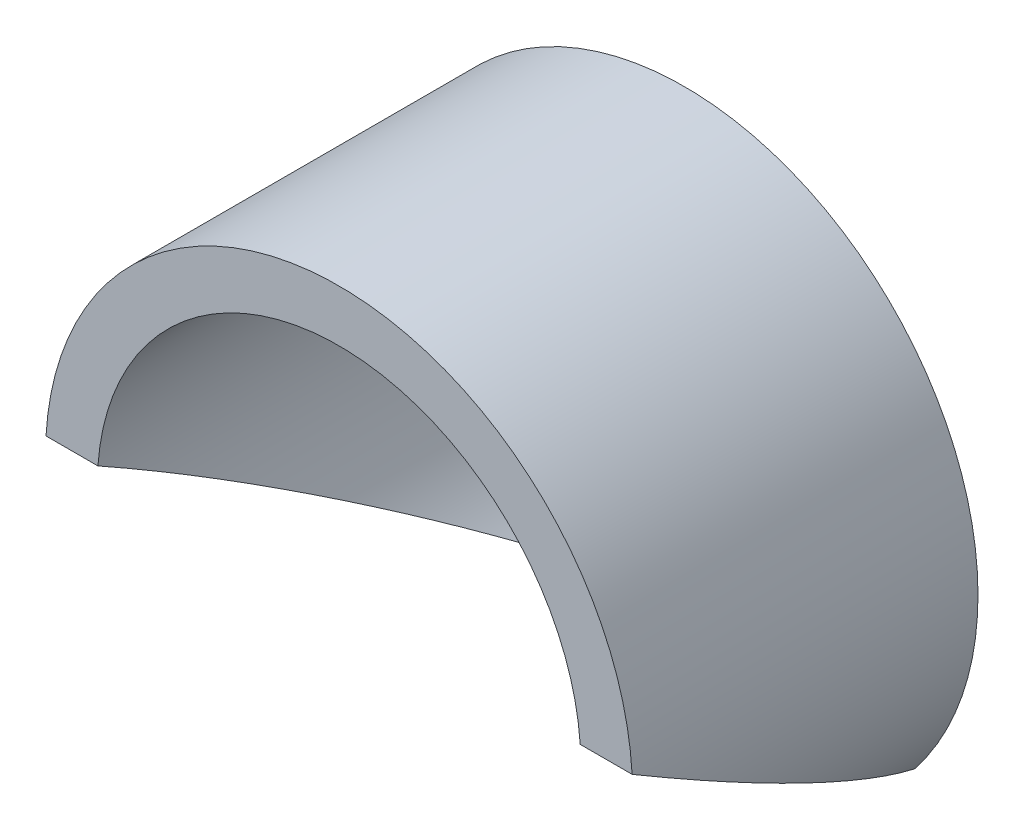
ISO-10303-21;
HEADER;
FILE_DESCRIPTION(('STEP AP214'),'2;1');
FILE_NAME('part.step','',(''),(''),'','','');
FILE_SCHEMA(('AUTOMOTIVE_DESIGN { 1 0 10303 214 1 1 1 1 }'));
ENDSEC;
DATA;
#1=APPLICATION_CONTEXT('core data for automotive mechanical design processes');
#2=APPLICATION_PROTOCOL_DEFINITION('international standard','automotive_design',2000,#1);
#3=PRODUCT_CONTEXT('',#1,'mechanical');
#4=PRODUCT('Part','Part','',(#3));
#5=PRODUCT_RELATED_PRODUCT_CATEGORY('part','',(#4));
#6=PRODUCT_DEFINITION_FORMATION('','',#4);
#7=PRODUCT_DEFINITION_CONTEXT('part definition',#1,'design');
#8=PRODUCT_DEFINITION('design','',#6,#7);
#9=PRODUCT_DEFINITION_SHAPE('','',#8);
#10=(LENGTH_UNIT() NAMED_UNIT(*) SI_UNIT(.MILLI.,.METRE.));
#11=(NAMED_UNIT(*) PLANE_ANGLE_UNIT() SI_UNIT($,.RADIAN.));
#12=(NAMED_UNIT(*) SI_UNIT($,.STERADIAN.) SOLID_ANGLE_UNIT());
#13=UNCERTAINTY_MEASURE_WITH_UNIT(LENGTH_MEASURE(1.E-05),#10,'distance_accuracy_value','');
#14=(GEOMETRIC_REPRESENTATION_CONTEXT(3) GLOBAL_UNCERTAINTY_ASSIGNED_CONTEXT((#13)) GLOBAL_UNIT_ASSIGNED_CONTEXT((#10,
#11,#12)) REPRESENTATION_CONTEXT('',''));
#15=CARTESIAN_POINT('',(0.,0.,0.));
#16=DIRECTION('',(0.,0.,1.));
#17=DIRECTION('',(1.,0.,0.));
#18=AXIS2_PLACEMENT_3D('',#15,#16,#17);
#19=CARTESIAN_POINT('',(0.,0.,57.2500000000001));
#20=DIRECTION('',(0.,0.,1.));
#21=DIRECTION('',(1.,0.,0.));
#22=AXIS2_PLACEMENT_3D('',#19,#20,#21);
#23=PLANE('',#22);
#24=DIRECTION('',(-1.,0.,0.));
#25=VECTOR('',#24,1.);
#26=CARTESIAN_POINT('',(122.20013168598,106.324972242779,57.2500000000001));
#27=LINE('',#26,#25);
#28=CARTESIAN_POINT('',(126.312859700873,106.324972242779,57.2500000000001));
#29=VERTEX_POINT('',#28);
#30=CARTESIAN_POINT('',(122.20013168598,106.324972242779,57.2500000000001));
#31=VERTEX_POINT('',#30);
#32=EDGE_CURVE('E167',#29,#31,#27,.T.);
#33=ORIENTED_EDGE('',*,*,#32,.T.);
#34=CARTESIAN_POINT('',(112.95013168598,116.833897021271,57.2500000000001));
#35=DIRECTION('',(0.,0.,1.));
#36=DIRECTION('',(1.,0.,0.));
#37=AXIS2_PLACEMENT_3D('',#34,#35,#36);
#38=CIRCLE('',#37,14.);
#39=CARTESIAN_POINT('',(103.70013168598,106.324972242779,57.2500000000001));
#40=VERTEX_POINT('',#39);
#41=EDGE_CURVE('E146',#31,#40,#38,.T.);
#42=ORIENTED_EDGE('',*,*,#41,.T.);
#43=DIRECTION('',(-1.,0.,0.));
#44=VECTOR('',#43,1.);
#45=CARTESIAN_POINT('',(0.,106.324972242779,57.2500000000001));
#46=LINE('',#45,#44);
#47=CARTESIAN_POINT('',(99.5874036710872,106.324972242779,57.2500000000001));
#48=VERTEX_POINT('',#47);
#49=EDGE_CURVE('E156',#40,#48,#46,.T.);
#50=ORIENTED_EDGE('',*,*,#49,.T.);
#51=CARTESIAN_POINT('',(112.95013168598,116.833897021271,57.2500000000001));
#52=DIRECTION('',(0.,0.,-1.));
#53=DIRECTION('',(1.,0.,0.));
#54=AXIS2_PLACEMENT_3D('',#51,#52,#53);
#55=CIRCLE('',#54,17.);
#56=EDGE_CURVE('E169',#48,#29,#55,.T.);
#57=ORIENTED_EDGE('',*,*,#56,.T.);
#58=EDGE_LOOP('',(#33,#42,#50,#57));
#59=FACE_BOUND('',#58,.T.);
#60=ADVANCED_FACE('F84',(#59),#23,.F.);
#61=CARTESIAN_POINT('',(122.20013168598,106.324972242779,77.2500000000001));
#62=DIRECTION('',(0.,-1.,0.));
#63=DIRECTION('',(0.,0.,-1.));
#64=AXIS2_PLACEMENT_3D('',#61,#62,#63);
#65=PLANE('',#64);
#66=DIRECTION('',(0.,0.,-1.));
#67=VECTOR('',#66,1.);
#68=CARTESIAN_POINT('',(126.312859700873,106.324972242779,77.2500000000001));
#69=LINE('',#68,#67);
#70=CARTESIAN_POINT('',(126.312859700873,106.324972242779,57.3314157129576));
#71=VERTEX_POINT('',#70);
#72=EDGE_CURVE('E152',#71,#29,#69,.T.);
#73=ORIENTED_EDGE('',*,*,#72,.F.);
#74=DIRECTION('',(-1.,0.,0.));
#75=VECTOR('',#74,1.);
#76=CARTESIAN_POINT('',(122.20013168598,106.324972242779,57.3314157129576));
#77=LINE('',#76,#75);
#78=CARTESIAN_POINT('',(122.20013168598,106.324972242779,57.3314157129576));
#79=VERTEX_POINT('',#78);
#80=EDGE_CURVE('E186',#71,#79,#77,.T.);
#81=ORIENTED_EDGE('',*,*,#80,.T.);
#82=DIRECTION('',(0.,0.,-1.));
#83=VECTOR('',#82,1.);
#84=CARTESIAN_POINT('',(122.20013168598,106.324972242779,77.2500000000001));
#85=LINE('',#84,#83);
#86=EDGE_CURVE('E179',#79,#31,#85,.T.);
#87=ORIENTED_EDGE('',*,*,#86,.T.);
#88=ORIENTED_EDGE('',*,*,#32,.F.);
#89=EDGE_LOOP('',(#73,#81,#87,#88));
#90=FACE_BOUND('',#89,.T.);
#91=ADVANCED_FACE('F209',(#90),#65,.T.);
#92=CARTESIAN_POINT('',(112.95013168598,116.833897021271,77.2500000000001));
#93=DIRECTION('',(0.,0.,-1.));
#94=DIRECTION('',(-1.,0.,0.));
#95=AXIS2_PLACEMENT_3D('',#92,#93,#94);
#96=CYLINDRICAL_SURFACE('',#95,14.);
#97=ORIENTED_EDGE('',*,*,#86,.F.);
#98=CARTESIAN_POINT('',(112.95013168598,116.833897021271,75.5334073622251));
#99=DIRECTION('',(0.,0.866025403784441,-0.499999999999996));
#100=DIRECTION('',(0.,-0.499999999999996,-0.866025403784441));
#101=AXIS2_PLACEMENT_3D('',#98,#99,#100);
#102=ELLIPSE('',#101,28.0000000000002,14.);
#103=CARTESIAN_POINT('',(126.915007979929,117.824972242779,77.2500000000001));
#104=VERTEX_POINT('',#103);
#105=EDGE_CURVE('E192',#79,#104,#102,.F.);
#106=ORIENTED_EDGE('',*,*,#105,.T.);
#107=CARTESIAN_POINT('',(112.95013168598,116.833897021271,77.2500000000001));
#108=DIRECTION('',(0.,0.,1.));
#109=DIRECTION('',(1.,0.,0.));
#110=AXIS2_PLACEMENT_3D('',#107,#108,#109);
#111=CIRCLE('',#110,14.);
#112=CARTESIAN_POINT('',(98.9852553920305,117.824972242779,77.2500000000001));
#113=VERTEX_POINT('',#112);
#114=EDGE_CURVE('E178',#104,#113,#111,.T.);
#115=ORIENTED_EDGE('',*,*,#114,.T.);
#116=CARTESIAN_POINT('',(112.95013168598,116.833897021271,75.5334073622251));
#117=DIRECTION('',(0.,-0.866025403784441,0.499999999999996));
#118=DIRECTION('',(0.,-0.499999999999996,-0.866025403784441));
#119=AXIS2_PLACEMENT_3D('',#116,#117,#118);
#120=ELLIPSE('',#119,28.0000000000002,14.);
#121=CARTESIAN_POINT('',(103.70013168598,106.324972242779,57.3314157129576));
#122=VERTEX_POINT('',#121);
#123=EDGE_CURVE('E149',#113,#122,#120,.T.);
#124=ORIENTED_EDGE('',*,*,#123,.T.);
#125=DIRECTION('',(0.,0.,-1.));
#126=VECTOR('',#125,1.);
#127=CARTESIAN_POINT('',(103.70013168598,106.324972242779,77.2500000000001));
#128=LINE('',#127,#126);
#129=EDGE_CURVE('E141',#122,#40,#128,.T.);
#130=ORIENTED_EDGE('',*,*,#129,.T.);
#131=ORIENTED_EDGE('',*,*,#41,.F.);
#132=EDGE_LOOP('',(#97,#106,#115,#124,#130,#131));
#133=FACE_BOUND('',#132,.T.);
#134=ADVANCED_FACE('F144',(#133),#96,.F.);
#135=CARTESIAN_POINT('',(112.95013168598,116.833897021271,77.2500000000001));
#136=DIRECTION('',(0.,0.,-1.));
#137=DIRECTION('',(-1.,0.,0.));
#138=AXIS2_PLACEMENT_3D('',#135,#136,#137);
#139=CYLINDRICAL_SURFACE('',#138,17.);
#140=CARTESIAN_POINT('',(112.95013168598,116.833897021271,77.2500000000001));
#141=DIRECTION('',(0.,0.,-1.));
#142=DIRECTION('',(1.,0.,0.));
#143=AXIS2_PLACEMENT_3D('',#140,#141,#142);
#144=CIRCLE('',#143,17.);
#145=CARTESIAN_POINT('',(95.9790453947224,117.824972242779,77.2500000000001));
#146=VERTEX_POINT('',#145);
#147=CARTESIAN_POINT('',(129.921217977238,117.824972242779,77.2500000000001));
#148=VERTEX_POINT('',#147);
#149=EDGE_CURVE('E153',#146,#148,#144,.T.);
#150=ORIENTED_EDGE('',*,*,#149,.T.);
#151=CARTESIAN_POINT('',(112.95013168598,116.833897021271,75.5334073622251));
#152=DIRECTION('',(0.,0.866025403784441,-0.499999999999996));
#153=DIRECTION('',(0.,-0.499999999999996,-0.866025403784441));
#154=AXIS2_PLACEMENT_3D('',#151,#152,#153);
#155=ELLIPSE('',#154,34.0000000000002,17.);
#156=EDGE_CURVE('E94',#148,#71,#155,.T.);
#157=ORIENTED_EDGE('',*,*,#156,.T.);
#158=ORIENTED_EDGE('',*,*,#72,.T.);
#159=ORIENTED_EDGE('',*,*,#56,.F.);
#160=DIRECTION('',(0.,0.,-1.));
#161=VECTOR('',#160,1.);
#162=CARTESIAN_POINT('',(99.5874036710872,106.324972242779,57.2500000000001));
#163=LINE('',#162,#161);
#164=CARTESIAN_POINT('',(99.5874036710872,106.324972242779,57.3314157129576));
#165=VERTEX_POINT('',#164);
#166=EDGE_CURVE('E159',#165,#48,#163,.T.);
#167=ORIENTED_EDGE('',*,*,#166,.F.);
#168=CARTESIAN_POINT('',(112.95013168598,116.833897021271,75.5334073622251));
#169=DIRECTION('',(0.,-0.866025403784441,0.499999999999996));
#170=DIRECTION('',(0.,-0.499999999999996,-0.866025403784441));
#171=AXIS2_PLACEMENT_3D('',#168,#169,#170);
#172=ELLIPSE('',#171,34.0000000000002,17.);
#173=EDGE_CURVE('E101',#165,#146,#172,.F.);
#174=ORIENTED_EDGE('',*,*,#173,.T.);
#175=EDGE_LOOP('',(#150,#157,#158,#159,#167,#174));
#176=FACE_BOUND('',#175,.T.);
#177=ADVANCED_FACE('F205',(#176),#139,.T.);
#178=CARTESIAN_POINT('',(112.95013168598,116.833897021271,77.2500000000001));
#179=DIRECTION('',(0.,0.,1.));
#180=DIRECTION('',(1.,0.,0.));
#181=AXIS2_PLACEMENT_3D('',#178,#179,#180);
#182=PLANE('',#181);
#183=ORIENTED_EDGE('',*,*,#114,.F.);
#184=DIRECTION('',(1.,0.,0.));
#185=VECTOR('',#184,1.);
#186=CARTESIAN_POINT('',(112.95013168598,117.824972242779,77.2500000000001));
#187=LINE('',#186,#185);
#188=EDGE_CURVE('E108',#104,#148,#187,.T.);
#189=ORIENTED_EDGE('',*,*,#188,.T.);
#190=ORIENTED_EDGE('',*,*,#149,.F.);
#191=DIRECTION('',(1.,0.,0.));
#192=VECTOR('',#191,1.);
#193=CARTESIAN_POINT('',(103.70013168598,117.824972242779,77.2500000000001));
#194=LINE('',#193,#192);
#195=EDGE_CURVE('E195',#146,#113,#194,.T.);
#196=ORIENTED_EDGE('',*,*,#195,.T.);
#197=EDGE_LOOP('',(#183,#189,#190,#196));
#198=FACE_BOUND('',#197,.T.);
#199=ADVANCED_FACE('F211',(#198),#182,.T.);
#200=CARTESIAN_POINT('',(205.172599070131,106.324972242779,112.25));
#201=DIRECTION('',(0.,1.,0.));
#202=DIRECTION('',(0.,0.,1.));
#203=AXIS2_PLACEMENT_3D('',#200,#201,#202);
#204=PLANE('',#203);
#205=ORIENTED_EDGE('',*,*,#129,.F.);
#206=DIRECTION('',(-1.,0.,0.));
#207=VECTOR('',#206,1.);
#208=CARTESIAN_POINT('',(99.5874036710872,106.324972242779,57.3314157129576));
#209=LINE('',#208,#207);
#210=EDGE_CURVE('E13',#122,#165,#209,.T.);
#211=ORIENTED_EDGE('',*,*,#210,.T.);
#212=ORIENTED_EDGE('',*,*,#166,.T.);
#213=ORIENTED_EDGE('',*,*,#49,.F.);
#214=EDGE_LOOP('',(#205,#211,#212,#213));
#215=FACE_BOUND('',#214,.T.);
#216=ADVANCED_FACE('F157',(#215),#204,.F.);
#217=CARTESIAN_POINT('',(122.20013168598,106.324972242779,57.3314157129576));
#218=DIRECTION('',(0.,0.866025403784441,-0.499999999999996));
#219=DIRECTION('',(-1.,0.,0.));
#220=AXIS2_PLACEMENT_3D('',#217,#218,#219);
#221=PLANE('',#220);
#222=ORIENTED_EDGE('',*,*,#156,.F.);
#223=ORIENTED_EDGE('',*,*,#188,.F.);
#224=ORIENTED_EDGE('',*,*,#105,.F.);
#225=ORIENTED_EDGE('',*,*,#80,.F.);
#226=EDGE_LOOP('',(#222,#223,#224,#225));
#227=FACE_BOUND('',#226,.T.);
#228=ADVANCED_FACE('F210',(#227),#221,.F.);
#229=CARTESIAN_POINT('',(205.172599070131,106.324972242779,57.3314157129576));
#230=DIRECTION('',(0.,-0.866025403784441,0.499999999999996));
#231=DIRECTION('',(1.,0.,0.));
#232=AXIS2_PLACEMENT_3D('',#229,#230,#231);
#233=PLANE('',#232);
#234=ORIENTED_EDGE('',*,*,#123,.F.);
#235=ORIENTED_EDGE('',*,*,#195,.F.);
#236=ORIENTED_EDGE('',*,*,#173,.F.);
#237=ORIENTED_EDGE('',*,*,#210,.F.);
#238=EDGE_LOOP('',(#234,#235,#236,#237));
#239=FACE_BOUND('',#238,.T.);
#240=ADVANCED_FACE('F87',(#239),#233,.T.);
#241=CLOSED_SHELL('',(#60,#91,#134,#177,#199,#216,#228,#240));
#242=MANIFOLD_SOLID_BREP('B2',#241);
#243=ADVANCED_BREP_SHAPE_REPRESENTATION('',(#18,#242),#14);
#244=SHAPE_DEFINITION_REPRESENTATION(#9,#243);
ENDSEC;
END-ISO-10303-21;
